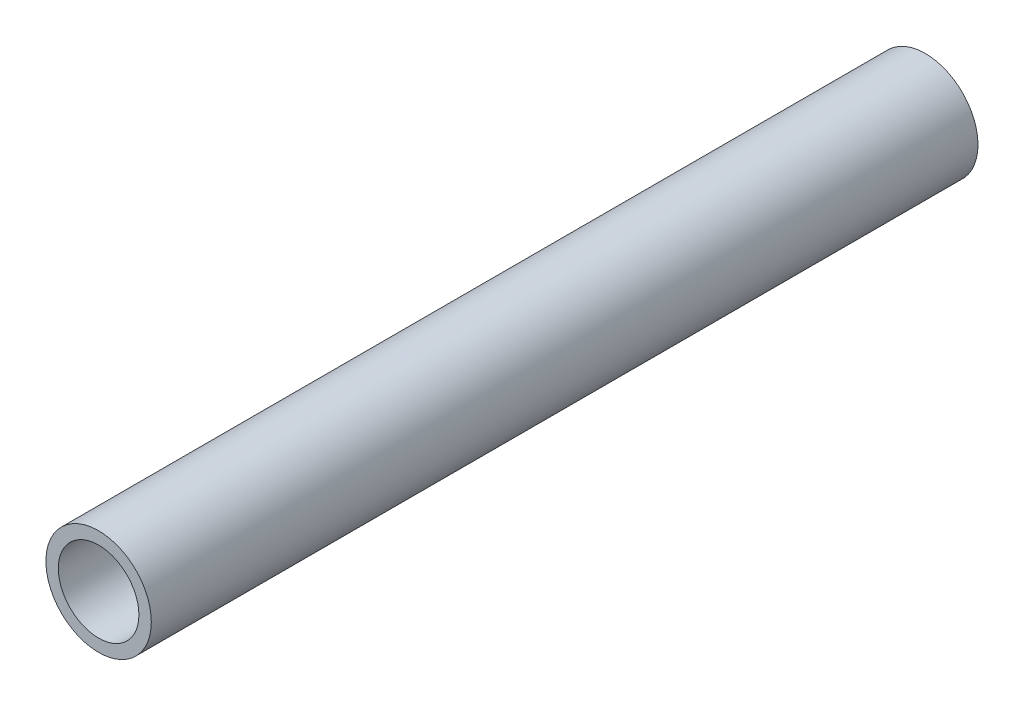
ISO-10303-21;
HEADER;
FILE_DESCRIPTION(('STEP AP214'),'2;1');
FILE_NAME('part.step','',(''),(''),'','','');
FILE_SCHEMA(('AUTOMOTIVE_DESIGN { 1 0 10303 214 1 1 1 1 }'));
ENDSEC;
DATA;
#1=APPLICATION_CONTEXT('core data for automotive mechanical design processes');
#2=APPLICATION_PROTOCOL_DEFINITION('international standard','automotive_design',2000,#1);
#3=PRODUCT_CONTEXT('',#1,'mechanical');
#4=PRODUCT('Part','Part','',(#3));
#5=PRODUCT_RELATED_PRODUCT_CATEGORY('part','',(#4));
#6=PRODUCT_DEFINITION_FORMATION('','',#4);
#7=PRODUCT_DEFINITION_CONTEXT('part definition',#1,'design');
#8=PRODUCT_DEFINITION('design','',#6,#7);
#9=PRODUCT_DEFINITION_SHAPE('','',#8);
#10=(LENGTH_UNIT() NAMED_UNIT(*) SI_UNIT(.MILLI.,.METRE.));
#11=(NAMED_UNIT(*) PLANE_ANGLE_UNIT() SI_UNIT($,.RADIAN.));
#12=(NAMED_UNIT(*) SI_UNIT($,.STERADIAN.) SOLID_ANGLE_UNIT());
#13=UNCERTAINTY_MEASURE_WITH_UNIT(LENGTH_MEASURE(1.E-05),#10,'distance_accuracy_value','');
#14=(GEOMETRIC_REPRESENTATION_CONTEXT(3) GLOBAL_UNCERTAINTY_ASSIGNED_CONTEXT((#13)) GLOBAL_UNIT_ASSIGNED_CONTEXT((#10,
#11,#12)) REPRESENTATION_CONTEXT('',''));
#15=CARTESIAN_POINT('',(0.,0.,0.));
#16=DIRECTION('',(0.,0.,1.));
#17=DIRECTION('',(1.,0.,0.));
#18=AXIS2_PLACEMENT_3D('',#15,#16,#17);
#19=CARTESIAN_POINT('',(0.,0.,10.16));
#20=DIRECTION('',(0.,0.,1.));
#21=DIRECTION('',(1.,0.,0.));
#22=AXIS2_PLACEMENT_3D('',#19,#20,#21);
#23=PLANE('',#22);
#24=CARTESIAN_POINT('',(0.,0.,10.16));
#25=DIRECTION('',(0.,0.,1.));
#26=DIRECTION('',(1.,0.,0.));
#27=AXIS2_PLACEMENT_3D('',#24,#25,#26);
#28=CIRCLE('',#27,0.6477);
#29=CARTESIAN_POINT('',(0.6477,0.,10.16));
#30=VERTEX_POINT('',#29);
#31=EDGE_CURVE('E10',#30,#30,#28,.T.);
#32=ORIENTED_EDGE('',*,*,#31,.T.);
#33=EDGE_LOOP('',(#32));
#34=FACE_BOUND('',#33,.T.);
#35=CARTESIAN_POINT('',(0.,0.,10.16));
#36=DIRECTION('',(0.,0.,1.));
#37=DIRECTION('',(1.,0.,0.));
#38=AXIS2_PLACEMENT_3D('',#35,#36,#37);
#39=CIRCLE('',#38,0.4953);
#40=CARTESIAN_POINT('',(0.4953,0.,10.16));
#41=VERTEX_POINT('',#40);
#42=EDGE_CURVE('E50',#41,#41,#39,.T.);
#43=ORIENTED_EDGE('',*,*,#42,.F.);
#44=EDGE_LOOP('',(#43));
#45=FACE_BOUND('',#44,.T.);
#46=ADVANCED_FACE('F37',(#34,#45),#23,.T.);
#47=CARTESIAN_POINT('',(0.,0.,0.));
#48=DIRECTION('',(0.,0.,1.));
#49=DIRECTION('',(1.,0.,0.));
#50=AXIS2_PLACEMENT_3D('',#47,#48,#49);
#51=PLANE('',#50);
#52=CARTESIAN_POINT('',(0.,0.,0.));
#53=DIRECTION('',(0.,0.,1.));
#54=DIRECTION('',(1.,0.,0.));
#55=AXIS2_PLACEMENT_3D('',#52,#53,#54);
#56=CIRCLE('',#55,0.6477);
#57=CARTESIAN_POINT('',(0.6477,0.,0.));
#58=VERTEX_POINT('',#57);
#59=EDGE_CURVE('E41',#58,#58,#56,.T.);
#60=ORIENTED_EDGE('',*,*,#59,.F.);
#61=EDGE_LOOP('',(#60));
#62=FACE_BOUND('',#61,.T.);
#63=CARTESIAN_POINT('',(0.,0.,0.));
#64=DIRECTION('',(0.,0.,1.));
#65=DIRECTION('',(1.,0.,0.));
#66=AXIS2_PLACEMENT_3D('',#63,#64,#65);
#67=CIRCLE('',#66,0.4953);
#68=CARTESIAN_POINT('',(0.4953,0.,0.));
#69=VERTEX_POINT('',#68);
#70=EDGE_CURVE('E52',#69,#69,#67,.T.);
#71=ORIENTED_EDGE('',*,*,#70,.T.);
#72=EDGE_LOOP('',(#71));
#73=FACE_BOUND('',#72,.T.);
#74=ADVANCED_FACE('F64',(#62,#73),#51,.F.);
#75=CARTESIAN_POINT('',(0.,0.,10.16));
#76=DIRECTION('',(0.,0.,-1.));
#77=DIRECTION('',(-1.,0.,0.));
#78=AXIS2_PLACEMENT_3D('',#75,#76,#77);
#79=CYLINDRICAL_SURFACE('',#78,0.6477);
#80=ORIENTED_EDGE('',*,*,#31,.F.);
#81=EDGE_LOOP('',(#80));
#82=FACE_BOUND('',#81,.T.);
#83=ORIENTED_EDGE('',*,*,#59,.T.);
#84=EDGE_LOOP('',(#83));
#85=FACE_BOUND('',#84,.T.);
#86=ADVANCED_FACE('F39',(#82,#85),#79,.T.);
#87=CARTESIAN_POINT('',(0.,0.,10.16));
#88=DIRECTION('',(0.,0.,-1.));
#89=DIRECTION('',(-1.,0.,0.));
#90=AXIS2_PLACEMENT_3D('',#87,#88,#89);
#91=CYLINDRICAL_SURFACE('',#90,0.4953);
#92=ORIENTED_EDGE('',*,*,#42,.T.);
#93=EDGE_LOOP('',(#92));
#94=FACE_BOUND('',#93,.T.);
#95=ORIENTED_EDGE('',*,*,#70,.F.);
#96=EDGE_LOOP('',(#95));
#97=FACE_BOUND('',#96,.T.);
#98=ADVANCED_FACE('F60',(#94,#97),#91,.F.);
#99=CLOSED_SHELL('',(#46,#74,#86,#98));
#100=MANIFOLD_SOLID_BREP('B2',#99);
#101=ADVANCED_BREP_SHAPE_REPRESENTATION('',(#18,#100),#14);
#102=SHAPE_DEFINITION_REPRESENTATION(#9,#101);
ENDSEC;
END-ISO-10303-21;
